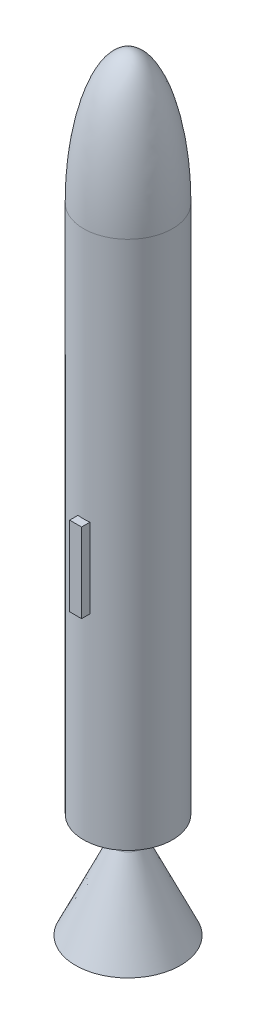
ISO-10303-21;
HEADER;
FILE_DESCRIPTION(('STEP AP214'),'2;1');
FILE_NAME('part.step','',(''),(''),'','','');
FILE_SCHEMA(('AUTOMOTIVE_DESIGN { 1 0 10303 214 1 1 1 1 }'));
ENDSEC;
DATA;
#1=APPLICATION_CONTEXT('core data for automotive mechanical design processes');
#2=APPLICATION_PROTOCOL_DEFINITION('international standard','automotive_design',2000,#1);
#3=PRODUCT_CONTEXT('',#1,'mechanical');
#4=PRODUCT('Part','Part','',(#3));
#5=PRODUCT_RELATED_PRODUCT_CATEGORY('part','',(#4));
#6=PRODUCT_DEFINITION_FORMATION('','',#4);
#7=PRODUCT_DEFINITION_CONTEXT('part definition',#1,'design');
#8=PRODUCT_DEFINITION('design','',#6,#7);
#9=PRODUCT_DEFINITION_SHAPE('','',#8);
#10=(LENGTH_UNIT() NAMED_UNIT(*) SI_UNIT(.MILLI.,.METRE.));
#11=(NAMED_UNIT(*) PLANE_ANGLE_UNIT() SI_UNIT($,.RADIAN.));
#12=(NAMED_UNIT(*) SI_UNIT($,.STERADIAN.) SOLID_ANGLE_UNIT());
#13=UNCERTAINTY_MEASURE_WITH_UNIT(LENGTH_MEASURE(1.E-05),#10,'distance_accuracy_value','');
#14=(GEOMETRIC_REPRESENTATION_CONTEXT(3) GLOBAL_UNCERTAINTY_ASSIGNED_CONTEXT((#13)) GLOBAL_UNIT_ASSIGNED_CONTEXT((#10,
#11,#12)) REPRESENTATION_CONTEXT('',''));
#15=CARTESIAN_POINT('',(0.,0.,0.));
#16=DIRECTION('',(0.,0.,1.));
#17=DIRECTION('',(1.,0.,0.));
#18=AXIS2_PLACEMENT_3D('',#15,#16,#17);
#19=CARTESIAN_POINT('',(0.,0.,0.));
#20=DIRECTION('',(0.,1.,0.));
#21=DIRECTION('',(-1.,0.,0.));
#22=AXIS2_PLACEMENT_3D('',#19,#20,#21);
#23=CYLINDRICAL_SURFACE('',#22,56.);
#24=CARTESIAN_POINT('',(2.0122792321331E-13,-666.6,0.));
#25=DIRECTION('',(0.,1.,0.));
#26=DIRECTION('',(-1.,0.,0.));
#27=AXIS2_PLACEMENT_3D('',#24,#25,#26);
#28=CIRCLE('',#27,56.);
#29=CARTESIAN_POINT('',(-55.9999999999998,-666.6,0.));
#30=VERTEX_POINT('',#29);
#31=EDGE_CURVE('E123',#30,#30,#28,.T.);
#32=ORIENTED_EDGE('',*,*,#31,.T.);
#33=EDGE_LOOP('',(#32));
#34=FACE_BOUND('',#33,.T.);
#35=CARTESIAN_POINT('',(0.,0.,0.));
#36=DIRECTION('',(0.,1.,0.));
#37=DIRECTION('',(-1.,0.,0.));
#38=AXIS2_PLACEMENT_3D('',#35,#36,#37);
#39=CIRCLE('',#38,56.);
#40=CARTESIAN_POINT('',(-56.,0.,0.));
#41=VERTEX_POINT('',#40);
#42=EDGE_CURVE('E131',#41,#41,#39,.T.);
#43=ORIENTED_EDGE('',*,*,#42,.F.);
#44=EDGE_LOOP('',(#43));
#45=FACE_BOUND('',#44,.T.);
#46=DIRECTION('',(0.,1.,0.));
#47=VECTOR('',#46,1.);
#48=CARTESIAN_POINT('',(7.49999999999999,0.,55.4954953126828));
#49=LINE('',#48,#47);
#50=CARTESIAN_POINT('',(7.49999999999999,-416.6,55.4954953126828));
#51=VERTEX_POINT('',#50);
#52=CARTESIAN_POINT('',(7.49999999999999,-316.6,55.4954953126828));
#53=VERTEX_POINT('',#52);
#54=EDGE_CURVE('E11',#51,#53,#49,.T.);
#55=ORIENTED_EDGE('',*,*,#54,.F.);
#56=CARTESIAN_POINT('',(1.25759905206518E-13,-416.6,0.));
#57=DIRECTION('',(0.,1.,0.));
#58=DIRECTION('',(0.,0.,1.));
#59=AXIS2_PLACEMENT_3D('',#56,#57,#58);
#60=CIRCLE('',#59,56.);
#61=CARTESIAN_POINT('',(-7.50000000000001,-416.6,55.4954953126828));
#62=VERTEX_POINT('',#61);
#63=EDGE_CURVE('E118',#62,#51,#60,.T.);
#64=ORIENTED_EDGE('',*,*,#63,.F.);
#65=DIRECTION('',(0.,1.,0.));
#66=VECTOR('',#65,1.);
#67=CARTESIAN_POINT('',(-7.50000000000001,0.,55.4954953126828));
#68=LINE('',#67,#66);
#69=CARTESIAN_POINT('',(-7.49999999999992,-316.6,55.4954953126828));
#70=VERTEX_POINT('',#69);
#71=EDGE_CURVE('E68',#70,#62,#68,.F.);
#72=ORIENTED_EDGE('',*,*,#71,.F.);
#73=CARTESIAN_POINT('',(0.,-316.6,0.));
#74=DIRECTION('',(0.,-1.,0.));
#75=DIRECTION('',(0.,0.,-1.));
#76=AXIS2_PLACEMENT_3D('',#73,#74,#75);
#77=CIRCLE('',#76,56.);
#78=EDGE_CURVE('E57',#53,#70,#77,.T.);
#79=ORIENTED_EDGE('',*,*,#78,.F.);
#80=EDGE_LOOP('',(#55,#64,#72,#79));
#81=FACE_BOUND('',#80,.T.);
#82=ADVANCED_FACE('F50',(#34,#45,#81),#23,.T.);
#83=CARTESIAN_POINT('',(2.0122792321331E-13,-666.6,0.));
#84=DIRECTION('',(0.,1.,0.));
#85=DIRECTION('',(-1.,0.,0.));
#86=AXIS2_PLACEMENT_3D('',#83,#84,#85);
#87=PLANE('',#86);
#88=CARTESIAN_POINT('',(0.,-666.6,0.));
#89=DIRECTION('',(0.,-1.,0.));
#90=DIRECTION('',(0.,0.,-1.));
#91=AXIS2_PLACEMENT_3D('',#88,#89,#90);
#92=CIRCLE('',#91,19.4052674555902);
#93=CARTESIAN_POINT('',(0.,-666.6,-19.4052674555902));
#94=VERTEX_POINT('',#93);
#95=EDGE_CURVE('E119',#94,#94,#92,.T.);
#96=ORIENTED_EDGE('',*,*,#95,.F.);
#97=EDGE_LOOP('',(#96));
#98=FACE_BOUND('',#97,.T.);
#99=ORIENTED_EDGE('',*,*,#31,.F.);
#100=EDGE_LOOP('',(#99));
#101=FACE_BOUND('',#100,.T.);
#102=ADVANCED_FACE('F153',(#98,#101),#87,.F.);
#103=CARTESIAN_POINT('',(0.,0.,0.));
#104=DIRECTION('',(0.,0.,1.));
#105=DIRECTION('',(0.,1.,0.));
#106=AXIS2_PLACEMENT_3D('',#103,#104,#105);
#107=ELLIPSE('',#106,166.665,56.);
#108=TRIMMED_CURVE('',#107,(PARAMETER_VALUE(0.)),(PARAMETER_VALUE(3.14159265358979)),.T.,.PARAMETER.);
#109=CARTESIAN_POINT('',(0.,-166.665,0.));
#110=DIRECTION('',(0.,1.,0.));
#111=AXIS1_PLACEMENT('',#109,#110);
#112=SURFACE_OF_REVOLUTION('',#108,#111);
#113=CARTESIAN_POINT('',(0.,166.665,0.));
#114=VERTEX_POINT('',#113);
#115=VERTEX_LOOP('',#114);
#116=FACE_BOUND('',#115,.T.);
#117=ORIENTED_EDGE('',*,*,#42,.T.);
#118=EDGE_LOOP('',(#117));
#119=FACE_BOUND('',#118,.T.);
#120=ADVANCED_FACE('F47',(#116,#119),#112,.F.);
#121=CARTESIAN_POINT('',(0.,-798.6,0.));
#122=DIRECTION('',(0.,-1.,0.));
#123=DIRECTION('',(0.,0.,-1.));
#124=AXIS2_PLACEMENT_3D('',#121,#122,#123);
#125=PLANE('',#124);
#126=CARTESIAN_POINT('',(0.,-798.6,0.));
#127=DIRECTION('',(0.,-1.,0.));
#128=DIRECTION('',(0.,0.,-1.));
#129=AXIS2_PLACEMENT_3D('',#126,#127,#128);
#130=CIRCLE('',#129,66.);
#131=CARTESIAN_POINT('',(0.,-798.6,-66.));
#132=VERTEX_POINT('',#131);
#133=EDGE_CURVE('E132',#132,#132,#130,.T.);
#134=ORIENTED_EDGE('',*,*,#133,.T.);
#135=EDGE_LOOP('',(#134));
#136=FACE_BOUND('',#135,.T.);
#137=ADVANCED_FACE('F163',(#136),#125,.T.);
#138=CARTESIAN_POINT('',(0.,-798.6,0.));
#139=DIRECTION('',(0.,-1.,0.));
#140=DIRECTION('',(0.,0.,-1.));
#141=AXIS2_PLACEMENT_3D('',#138,#139,#140);
#142=CONICAL_SURFACE('',#141,66.,0.43633231299858);
#143=CARTESIAN_POINT('',(0.,-695.257855026945,0.));
#144=DIRECTION('',(0.,-1.,0.));
#145=DIRECTION('',(0.,0.,-1.));
#146=AXIS2_PLACEMENT_3D('',#143,#144,#145);
#147=CIRCLE('',#146,17.8107663889005);
#148=CARTESIAN_POINT('',(0.,-695.257855026945,-17.8107663889005));
#149=VERTEX_POINT('',#148);
#150=EDGE_CURVE('E126',#149,#149,#147,.T.);
#151=CARTESIAN_POINT('',(0.,-695.257855026945,-17.8107663889005));
#152=CARTESIAN_POINT('',(0.,-696.334335703747,-18.3127375723494));
#153=CARTESIAN_POINT('',(0.,-697.41081638055,-18.8147087557984));
#154=CARTESIAN_POINT('',(0.,-699.563777734155,-19.8186511226963));
#155=CARTESIAN_POINT('',(0.,-700.640258410958,-20.3206223061452));
#156=CARTESIAN_POINT('',(0.,-702.793219764563,-21.3245646730432));
#157=CARTESIAN_POINT('',(0.,-703.869700441366,-21.8265358564921));
#158=CARTESIAN_POINT('',(0.,-706.022661794971,-22.83047822339));
#159=CARTESIAN_POINT('',(0.,-707.099142471774,-23.332449406839));
#160=CARTESIAN_POINT('',(0.,-709.252103825379,-24.3363917737369));
#161=CARTESIAN_POINT('',(0.,-710.328584502182,-24.8383629571858));
#162=CARTESIAN_POINT('',(0.,-712.481545855787,-25.8423053240837));
#163=CARTESIAN_POINT('',(0.,-713.55802653259,-26.3442765075327));
#164=CARTESIAN_POINT('',(0.,-715.710987886195,-27.3482188744306));
#165=CARTESIAN_POINT('',(0.,-716.787468562998,-27.8501900578795));
#166=CARTESIAN_POINT('',(0.,-718.940429916603,-28.8541324247775));
#167=CARTESIAN_POINT('',(0.,-720.016910593406,-29.3561036082264));
#168=CARTESIAN_POINT('',(0.,-722.169871947011,-30.3600459751243));
#169=CARTESIAN_POINT('',(0.,-723.246352623814,-30.8620171585733));
#170=CARTESIAN_POINT('',(0.,-725.399313977419,-31.8659595254712));
#171=CARTESIAN_POINT('',(0.,-726.475794654222,-32.3679307089201));
#172=CARTESIAN_POINT('',(0.,-728.628756007827,-33.371873075818));
#173=CARTESIAN_POINT('',(0.,-729.70523668463,-33.873844259267));
#174=CARTESIAN_POINT('',(0.,-731.858198038235,-34.8777866261649));
#175=CARTESIAN_POINT('',(0.,-732.934678715038,-35.3797578096138));
#176=CARTESIAN_POINT('',(0.,-735.087640068643,-36.3837001765117));
#177=CARTESIAN_POINT('',(0.,-736.164120745446,-36.8856713599607));
#178=CARTESIAN_POINT('',(0.,-738.317082099051,-37.8896137268586));
#179=CARTESIAN_POINT('',(0.,-739.393562775854,-38.3915849103076));
#180=CARTESIAN_POINT('',(0.,-741.546524129459,-39.3955272772055));
#181=CARTESIAN_POINT('',(0.,-742.623004806262,-39.8974984606544));
#182=CARTESIAN_POINT('',(0.,-744.775966159867,-40.9014408275523));
#183=CARTESIAN_POINT('',(0.,-745.85244683667,-41.4034120110013));
#184=CARTESIAN_POINT('',(0.,-748.005408190275,-42.4073543778992));
#185=CARTESIAN_POINT('',(0.,-749.081888867078,-42.9093255613481));
#186=CARTESIAN_POINT('',(0.,-751.234850220683,-43.913267928246));
#187=CARTESIAN_POINT('',(0.,-752.311330897486,-44.415239111695));
#188=CARTESIAN_POINT('',(0.,-754.464292251091,-45.4191814785929));
#189=CARTESIAN_POINT('',(0.,-755.540772927894,-45.9211526620419));
#190=CARTESIAN_POINT('',(0.,-757.693734281499,-46.9250950289398));
#191=CARTESIAN_POINT('',(0.,-758.770214958301,-47.4270662123887));
#192=CARTESIAN_POINT('',(0.,-760.923176311907,-48.4310085792866));
#193=CARTESIAN_POINT('',(0.,-761.999656988709,-48.9329797627356));
#194=CARTESIAN_POINT('',(0.,-764.152618342315,-49.9369221296335));
#195=CARTESIAN_POINT('',(0.,-765.229099019117,-50.4388933130824));
#196=CARTESIAN_POINT('',(0.,-767.382060372723,-51.4428356799803));
#197=CARTESIAN_POINT('',(0.,-768.458541049525,-51.9448068634293));
#198=CARTESIAN_POINT('',(0.,-770.611502403131,-52.9487492303272));
#199=CARTESIAN_POINT('',(0.,-771.687983079933,-53.4507204137761));
#200=CARTESIAN_POINT('',(0.,-773.840944433539,-54.4546627806741));
#201=CARTESIAN_POINT('',(0.,-774.917425110341,-54.956633964123));
#202=CARTESIAN_POINT('',(0.,-777.070386463947,-55.9605763310209));
#203=CARTESIAN_POINT('',(0.,-778.146867140749,-56.4625475144699));
#204=CARTESIAN_POINT('',(0.,-780.299828494355,-57.4664898813678));
#205=CARTESIAN_POINT('',(0.,-781.376309171157,-57.9684610648167));
#206=CARTESIAN_POINT('',(0.,-783.529270524763,-58.9724034317146));
#207=CARTESIAN_POINT('',(0.,-784.605751201565,-59.4743746151636));
#208=CARTESIAN_POINT('',(0.,-786.758712555171,-60.4783169820615));
#209=CARTESIAN_POINT('',(0.,-787.835193231973,-60.9802881655104));
#210=CARTESIAN_POINT('',(0.,-789.988154585579,-61.9842305324084));
#211=CARTESIAN_POINT('',(0.,-791.064635262381,-62.4862017158573));
#212=CARTESIAN_POINT('',(0.,-793.217596615987,-63.4901440827552));
#213=CARTESIAN_POINT('',(0.,-794.294077292789,-63.9921152662042));
#214=CARTESIAN_POINT('',(0.,-796.447038646395,-64.9960576331021));
#215=CARTESIAN_POINT('',(0.,-797.523519323197,-65.498028816551));
#216=CARTESIAN_POINT('',(0.,-798.6,-66.));
#217=B_SPLINE_CURVE_WITH_KNOTS('',3,(#151,#152,#153,#154,#155,#156,#157,#158,#159,#160,#161,
#162,#163,#164,#165,#166,#167,#168,#169,#170,#171,#172,#173,#174,#175,#176,#177,#178,#179,#180,
#181,#182,#183,#184,#185,#186,#187,#188,#189,#190,#191,#192,#193,#194,#195,#196,#197,#198,#199,
#200,#201,#202,#203,#204,#205,#206,#207,#208,#209,#210,#211,#212,#213,#214,#215,#216),
.UNSPECIFIED.,.F.,.F.,(4,2,2,2,2,2,2,2,2,2,2,2,2,2,2,2,2,2,2,2,2,2,2,2,2,2,2,2,2,2,2,2,4),(0.,
3.56329502692156,7.12659005384311,10.6898850807647,14.2531801076862,17.8164751346078,
21.3797701615293,24.9430651884509,28.5063602153725,32.069655242294,35.6329502692156,
39.1962452961371,42.7595403230587,46.3228353499802,49.8861303769018,53.4494254038234,
57.0127204307449,60.5760154576665,64.139310484588,67.7026055115096,71.2659005384311,
74.8291955653527,78.3924905922743,81.9557856191958,85.5190806461174,89.0823756730389,
92.6456706999605,96.208965726882,99.7722607538036,103.335555780725,106.898850807647,
110.462145834568,114.02544086149),.UNSPECIFIED.);
#218=EDGE_CURVE('BSEAM170',#149,#132,#217,.T.);
#219=ORIENTED_EDGE('',*,*,#150,.T.);
#220=ORIENTED_EDGE('',*,*,#133,.F.);
#221=ORIENTED_EDGE('',*,*,#218,.T.);
#222=ORIENTED_EDGE('',*,*,#218,.F.);
#223=EDGE_LOOP('',(#219,#221,#220,#222));
#224=FACE_BOUND('',#223,.T.);
#225=ADVANCED_FACE('F170',(#224),#142,.T.);
#226=CARTESIAN_POINT('',(0.,-682.579307174724,0.));
#227=DIRECTION('',(0.,-1.,0.));
#228=DIRECTION('',(0.,0.,-1.));
#229=AXIS2_PLACEMENT_3D('',#226,#227,#228);
#230=TOROIDAL_SURFACE('',#229,45.,30.);
#231=CARTESIAN_POINT('',(0.,-682.579307174723,0.));
#232=DIRECTION('',(0.,-1.,0.));
#233=DIRECTION('',(0.,0.,-1.));
#234=AXIS2_PLACEMENT_3D('',#231,#232,#233);
#235=CIRCLE('',#234,15.);
#236=CARTESIAN_POINT('',(0.,-682.579307174723,-15.));
#237=VERTEX_POINT('',#236);
#238=EDGE_CURVE('E122',#237,#237,#235,.T.);
#239=ORIENTED_EDGE('',*,*,#238,.T.);
#240=EDGE_LOOP('',(#239));
#241=FACE_BOUND('',#240,.T.);
#242=ORIENTED_EDGE('',*,*,#150,.F.);
#243=EDGE_LOOP('',(#242));
#244=FACE_BOUND('',#243,.T.);
#245=ADVANCED_FACE('F172',(#241,#244),#230,.F.);
#246=CARTESIAN_POINT('',(0.,-1354.26733873874,0.));
#247=DIRECTION('',(0.,-1.,0.));
#248=DIRECTION('',(0.,0.,-1.));
#249=AXIS2_PLACEMENT_3D('',#246,#247,#248);
#250=CYLINDRICAL_SURFACE('',#249,15.);
#251=CARTESIAN_POINT('',(0.,-682.268622826946,0.));
#252=DIRECTION('',(0.,-1.,0.));
#253=DIRECTION('',(0.,0.,-1.));
#254=AXIS2_PLACEMENT_3D('',#251,#252,#253);
#255=CIRCLE('',#254,15.);
#256=CARTESIAN_POINT('',(0.,-682.268622826946,-15.));
#257=VERTEX_POINT('',#256);
#258=EDGE_CURVE('E115',#257,#257,#255,.T.);
#259=ORIENTED_EDGE('',*,*,#258,.T.);
#260=EDGE_LOOP('',(#259));
#261=FACE_BOUND('',#260,.T.);
#262=ORIENTED_EDGE('',*,*,#238,.F.);
#263=EDGE_LOOP('',(#262));
#264=FACE_BOUND('',#263,.T.);
#265=ADVANCED_FACE('F173',(#261,#264),#250,.T.);
#266=CARTESIAN_POINT('',(0.,-682.268622826946,0.));
#267=DIRECTION('',(0.,-1.,0.));
#268=DIRECTION('',(0.,0.,-1.));
#269=AXIS2_PLACEMENT_3D('',#266,#267,#268);
#270=TOROIDAL_SURFACE('',#269,45.,30.);
#271=CARTESIAN_POINT('',(0.,-667.268622826945,0.));
#272=DIRECTION('',(0.,-1.,0.));
#273=DIRECTION('',(0.,0.,-1.));
#274=AXIS2_PLACEMENT_3D('',#271,#272,#273);
#275=CIRCLE('',#274,19.0192378864671);
#276=CARTESIAN_POINT('',(0.,-667.268622826945,-19.0192378864671));
#277=VERTEX_POINT('',#276);
#278=EDGE_CURVE('E108',#277,#277,#275,.T.);
#279=ORIENTED_EDGE('',*,*,#278,.T.);
#280=EDGE_LOOP('',(#279));
#281=FACE_BOUND('',#280,.T.);
#282=ORIENTED_EDGE('',*,*,#258,.F.);
#283=EDGE_LOOP('',(#282));
#284=FACE_BOUND('',#283,.T.);
#285=ADVANCED_FACE('F179',(#281,#284),#270,.F.);
#286=CARTESIAN_POINT('',(0.,-667.268622826945,0.));
#287=DIRECTION('',(0.,1.,0.));
#288=DIRECTION('',(0.,0.,1.));
#289=AXIS2_PLACEMENT_3D('',#286,#287,#288);
#290=CONICAL_SURFACE('',#289,19.0192378864671,0.523598775598307);
#291=ORIENTED_EDGE('',*,*,#95,.T.);
#292=EDGE_LOOP('',(#291));
#293=FACE_BOUND('',#292,.T.);
#294=ORIENTED_EDGE('',*,*,#278,.F.);
#295=EDGE_LOOP('',(#294));
#296=FACE_BOUND('',#295,.T.);
#297=ADVANCED_FACE('F181',(#293,#296),#290,.T.);
#298=CARTESIAN_POINT('',(7.49999999999999,-416.6,66.));
#299=DIRECTION('',(-1.,0.,0.));
#300=DIRECTION('',(0.,0.,1.));
#301=AXIS2_PLACEMENT_3D('',#298,#299,#300);
#302=PLANE('',#301);
#303=DIRECTION('',(0.,0.,-1.));
#304=VECTOR('',#303,1.);
#305=CARTESIAN_POINT('',(7.49999999999999,-416.6,66.));
#306=LINE('',#305,#304);
#307=CARTESIAN_POINT('',(7.49999999999999,-416.6,66.));
#308=VERTEX_POINT('',#307);
#309=EDGE_CURVE('E150',#308,#51,#306,.T.);
#310=ORIENTED_EDGE('',*,*,#309,.T.);
#311=ORIENTED_EDGE('',*,*,#54,.T.);
#312=DIRECTION('',(0.,0.,-1.));
#313=VECTOR('',#312,1.);
#314=CARTESIAN_POINT('',(7.49999999999999,-316.6,66.));
#315=LINE('',#314,#313);
#316=CARTESIAN_POINT('',(7.49999999999999,-316.6,66.));
#317=VERTEX_POINT('',#316);
#318=EDGE_CURVE('E95',#317,#53,#315,.T.);
#319=ORIENTED_EDGE('',*,*,#318,.F.);
#320=DIRECTION('',(0.,1.,0.));
#321=VECTOR('',#320,1.);
#322=CARTESIAN_POINT('',(7.49999999999999,-416.6,66.));
#323=LINE('',#322,#321);
#324=EDGE_CURVE('E98',#308,#317,#323,.T.);
#325=ORIENTED_EDGE('',*,*,#324,.F.);
#326=EDGE_LOOP('',(#310,#311,#319,#325));
#327=FACE_BOUND('',#326,.T.);
#328=ADVANCED_FACE('F107',(#327),#302,.F.);
#329=CARTESIAN_POINT('',(-7.50000000000001,-416.6,66.));
#330=DIRECTION('',(1.,0.,0.));
#331=DIRECTION('',(0.,0.,-1.));
#332=AXIS2_PLACEMENT_3D('',#329,#330,#331);
#333=PLANE('',#332);
#334=DIRECTION('',(0.,0.,-1.));
#335=VECTOR('',#334,1.);
#336=CARTESIAN_POINT('',(-7.50000000000001,-316.6,66.));
#337=LINE('',#336,#335);
#338=CARTESIAN_POINT('',(-7.50000000000001,-316.6,66.));
#339=VERTEX_POINT('',#338);
#340=EDGE_CURVE('E94',#339,#70,#337,.T.);
#341=ORIENTED_EDGE('',*,*,#340,.T.);
#342=ORIENTED_EDGE('',*,*,#71,.T.);
#343=DIRECTION('',(0.,0.,-1.));
#344=VECTOR('',#343,1.);
#345=CARTESIAN_POINT('',(-7.50000000000001,-416.6,66.));
#346=LINE('',#345,#344);
#347=CARTESIAN_POINT('',(-7.50000000000001,-416.6,66.));
#348=VERTEX_POINT('',#347);
#349=EDGE_CURVE('E111',#348,#62,#346,.T.);
#350=ORIENTED_EDGE('',*,*,#349,.F.);
#351=DIRECTION('',(0.,-1.,0.));
#352=VECTOR('',#351,1.);
#353=CARTESIAN_POINT('',(-7.50000000000001,-416.6,66.));
#354=LINE('',#353,#352);
#355=EDGE_CURVE('E100',#339,#348,#354,.T.);
#356=ORIENTED_EDGE('',*,*,#355,.F.);
#357=EDGE_LOOP('',(#341,#342,#350,#356));
#358=FACE_BOUND('',#357,.T.);
#359=ADVANCED_FACE('F141',(#358),#333,.F.);
#360=CARTESIAN_POINT('',(-7.50000000000001,-316.6,66.));
#361=DIRECTION('',(0.,-1.,0.));
#362=DIRECTION('',(0.,0.,-1.));
#363=AXIS2_PLACEMENT_3D('',#360,#361,#362);
#364=PLANE('',#363);
#365=ORIENTED_EDGE('',*,*,#318,.T.);
#366=ORIENTED_EDGE('',*,*,#78,.T.);
#367=ORIENTED_EDGE('',*,*,#340,.F.);
#368=DIRECTION('',(-1.,0.,0.));
#369=VECTOR('',#368,1.);
#370=CARTESIAN_POINT('',(-7.50000000000001,-316.6,66.));
#371=LINE('',#370,#369);
#372=EDGE_CURVE('E86',#317,#339,#371,.T.);
#373=ORIENTED_EDGE('',*,*,#372,.F.);
#374=EDGE_LOOP('',(#365,#366,#367,#373));
#375=FACE_BOUND('',#374,.T.);
#376=ADVANCED_FACE('F89',(#375),#364,.F.);
#377=CARTESIAN_POINT('',(-7.50000000000001,-416.6,66.));
#378=DIRECTION('',(0.,1.,0.));
#379=DIRECTION('',(0.,0.,1.));
#380=AXIS2_PLACEMENT_3D('',#377,#378,#379);
#381=PLANE('',#380);
#382=ORIENTED_EDGE('',*,*,#349,.T.);
#383=ORIENTED_EDGE('',*,*,#63,.T.);
#384=ORIENTED_EDGE('',*,*,#309,.F.);
#385=DIRECTION('',(1.,0.,0.));
#386=VECTOR('',#385,1.);
#387=CARTESIAN_POINT('',(-7.50000000000001,-416.6,66.));
#388=LINE('',#387,#386);
#389=EDGE_CURVE('E103',#348,#308,#388,.T.);
#390=ORIENTED_EDGE('',*,*,#389,.F.);
#391=EDGE_LOOP('',(#382,#383,#384,#390));
#392=FACE_BOUND('',#391,.T.);
#393=ADVANCED_FACE('F151',(#392),#381,.F.);
#394=CARTESIAN_POINT('',(0.,0.,66.));
#395=DIRECTION('',(0.,0.,-1.));
#396=DIRECTION('',(-1.,0.,0.));
#397=AXIS2_PLACEMENT_3D('',#394,#395,#396);
#398=PLANE('',#397);
#399=ORIENTED_EDGE('',*,*,#324,.T.);
#400=ORIENTED_EDGE('',*,*,#372,.T.);
#401=ORIENTED_EDGE('',*,*,#355,.T.);
#402=ORIENTED_EDGE('',*,*,#389,.T.);
#403=EDGE_LOOP('',(#399,#400,#401,#402));
#404=FACE_BOUND('',#403,.T.);
#405=ADVANCED_FACE('F101',(#404),#398,.F.);
#406=CLOSED_SHELL('',(#82,#102,#120,#137,#225,#245,#265,#285,#297,#328,#359,#376,#393,#405));
#407=MANIFOLD_SOLID_BREP('B2',#406);
#408=ADVANCED_BREP_SHAPE_REPRESENTATION('',(#18,#407),#14);
#409=SHAPE_DEFINITION_REPRESENTATION(#9,#408);
ENDSEC;
END-ISO-10303-21;
